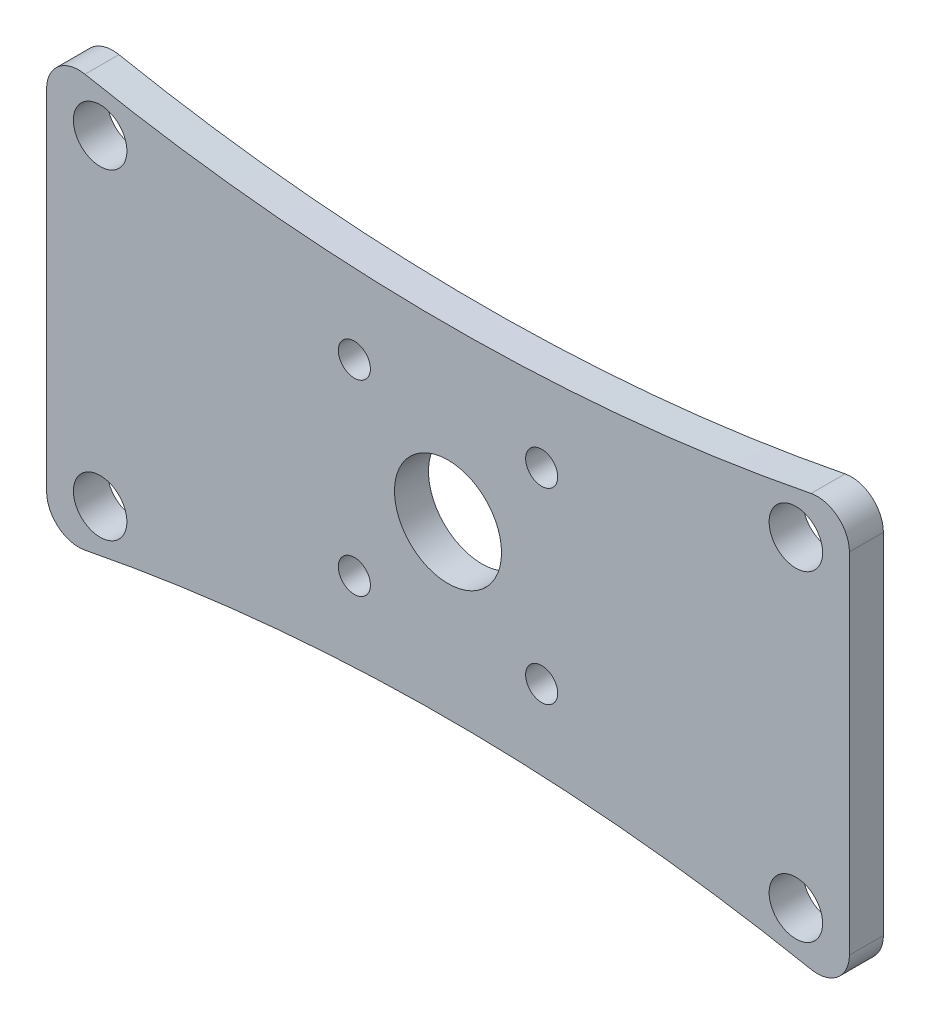
ISO-10303-21;
HEADER;
FILE_DESCRIPTION(('STEP AP214'),'2;1');
FILE_NAME('part.step','',(''),(''),'','','');
FILE_SCHEMA(('AUTOMOTIVE_DESIGN { 1 0 10303 214 1 1 1 1 }'));
ENDSEC;
DATA;
#1=APPLICATION_CONTEXT('core data for automotive mechanical design processes');
#2=APPLICATION_PROTOCOL_DEFINITION('international standard','automotive_design',2000,#1);
#3=PRODUCT_CONTEXT('',#1,'mechanical');
#4=PRODUCT('Part','Part','',(#3));
#5=PRODUCT_RELATED_PRODUCT_CATEGORY('part','',(#4));
#6=PRODUCT_DEFINITION_FORMATION('','',#4);
#7=PRODUCT_DEFINITION_CONTEXT('part definition',#1,'design');
#8=PRODUCT_DEFINITION('design','',#6,#7);
#9=PRODUCT_DEFINITION_SHAPE('','',#8);
#10=(LENGTH_UNIT() NAMED_UNIT(*) SI_UNIT(.MILLI.,.METRE.));
#11=(NAMED_UNIT(*) PLANE_ANGLE_UNIT() SI_UNIT($,.RADIAN.));
#12=(NAMED_UNIT(*) SI_UNIT($,.STERADIAN.) SOLID_ANGLE_UNIT());
#13=UNCERTAINTY_MEASURE_WITH_UNIT(LENGTH_MEASURE(1.E-05),#10,'distance_accuracy_value','');
#14=(GEOMETRIC_REPRESENTATION_CONTEXT(3) GLOBAL_UNCERTAINTY_ASSIGNED_CONTEXT((#13)) GLOBAL_UNIT_ASSIGNED_CONTEXT((#10,
#11,#12)) REPRESENTATION_CONTEXT('',''));
#15=CARTESIAN_POINT('',(0.,0.,0.));
#16=DIRECTION('',(0.,0.,1.));
#17=DIRECTION('',(1.,0.,0.));
#18=AXIS2_PLACEMENT_3D('',#15,#16,#17);
#19=CARTESIAN_POINT('',(0.,0.,3.175));
#20=DIRECTION('',(0.,0.,1.));
#21=DIRECTION('',(1.,0.,0.));
#22=AXIS2_PLACEMENT_3D('',#19,#20,#21);
#23=PLANE('',#22);
#24=CARTESIAN_POINT('',(0.,0.,3.175));
#25=DIRECTION('',(0.,0.,1.));
#26=DIRECTION('',(1.,0.,0.));
#27=AXIS2_PLACEMENT_3D('',#24,#25,#26);
#28=CIRCLE('',#27,5.);
#29=CARTESIAN_POINT('',(5.,0.,3.175));
#30=VERTEX_POINT('',#29);
#31=EDGE_CURVE('E213',#30,#30,#28,.T.);
#32=ORIENTED_EDGE('',*,*,#31,.F.);
#33=EDGE_LOOP('',(#32));
#34=FACE_BOUND('',#33,.T.);
#35=DIRECTION('',(0.,1.,0.));
#36=VECTOR('',#35,1.);
#37=CARTESIAN_POINT('',(37.5,20.,3.175));
#38=LINE('',#37,#36);
#39=CARTESIAN_POINT('',(37.5,-16.3103317887136,3.175));
#40=VERTEX_POINT('',#39);
#41=CARTESIAN_POINT('',(37.5,16.3103317887136,3.175));
#42=VERTEX_POINT('',#41);
#43=EDGE_CURVE('E120',#40,#42,#38,.T.);
#44=ORIENTED_EDGE('',*,*,#43,.T.);
#45=CARTESIAN_POINT('',(34.5,16.3103317887136,3.175));
#46=DIRECTION('',(0.,0.,1.));
#47=DIRECTION('',(1.,0.,0.));
#48=AXIS2_PLACEMENT_3D('',#45,#46,#47);
#49=CIRCLE('',#48,3.);
#50=CARTESIAN_POINT('',(33.9185393258427,19.2534429800226,3.175));
#51=VERTEX_POINT('',#50);
#52=EDGE_CURVE('E145',#42,#51,#49,.T.);
#53=ORIENTED_EDGE('',*,*,#52,.T.);
#54=CARTESIAN_POINT('',(0.,190.934929139717,3.175));
#55=DIRECTION('',(0.,0.,1.));
#56=DIRECTION('',(1.,0.,0.));
#57=AXIS2_PLACEMENT_3D('',#54,#55,#56);
#58=CIRCLE('',#57,175.);
#59=CARTESIAN_POINT('',(-33.9185393258427,19.2534429800226,3.175));
#60=VERTEX_POINT('',#59);
#61=EDGE_CURVE('E118',#60,#51,#58,.T.);
#62=ORIENTED_EDGE('',*,*,#61,.F.);
#63=CARTESIAN_POINT('',(-34.5,16.3103317887136,3.175));
#64=DIRECTION('',(0.,0.,1.));
#65=DIRECTION('',(1.,0.,0.));
#66=AXIS2_PLACEMENT_3D('',#63,#64,#65);
#67=CIRCLE('',#66,3.);
#68=CARTESIAN_POINT('',(-37.5,16.3103317887136,3.175));
#69=VERTEX_POINT('',#68);
#70=EDGE_CURVE('E53',#60,#69,#67,.T.);
#71=ORIENTED_EDGE('',*,*,#70,.T.);
#72=DIRECTION('',(0.,-1.,0.));
#73=VECTOR('',#72,1.);
#74=CARTESIAN_POINT('',(-37.5,20.,3.175));
#75=LINE('',#74,#73);
#76=CARTESIAN_POINT('',(-37.5,-16.3103317887136,3.175));
#77=VERTEX_POINT('',#76);
#78=EDGE_CURVE('E124',#69,#77,#75,.T.);
#79=ORIENTED_EDGE('',*,*,#78,.T.);
#80=CARTESIAN_POINT('',(-34.5,-16.3103317887136,3.175));
#81=DIRECTION('',(0.,0.,1.));
#82=DIRECTION('',(1.,0.,0.));
#83=AXIS2_PLACEMENT_3D('',#80,#81,#82);
#84=CIRCLE('',#83,3.);
#85=CARTESIAN_POINT('',(-33.9185393258427,-19.2534429800226,3.175));
#86=VERTEX_POINT('',#85);
#87=EDGE_CURVE('E141',#77,#86,#84,.T.);
#88=ORIENTED_EDGE('',*,*,#87,.T.);
#89=CARTESIAN_POINT('',(0.,-190.934929139717,3.175));
#90=DIRECTION('',(0.,0.,1.));
#91=DIRECTION('',(1.,0.,0.));
#92=AXIS2_PLACEMENT_3D('',#89,#90,#91);
#93=CIRCLE('',#92,175.);
#94=CARTESIAN_POINT('',(33.9185393258427,-19.2534429800226,3.175));
#95=VERTEX_POINT('',#94);
#96=EDGE_CURVE('E207',#95,#86,#93,.T.);
#97=ORIENTED_EDGE('',*,*,#96,.F.);
#98=CARTESIAN_POINT('',(34.5,-16.3103317887136,3.175));
#99=DIRECTION('',(0.,0.,1.));
#100=DIRECTION('',(1.,0.,0.));
#101=AXIS2_PLACEMENT_3D('',#98,#99,#100);
#102=CIRCLE('',#101,3.);
#103=EDGE_CURVE('E143',#95,#40,#102,.T.);
#104=ORIENTED_EDGE('',*,*,#103,.T.);
#105=EDGE_LOOP('',(#44,#53,#62,#71,#79,#88,#97,#104));
#106=FACE_BOUND('',#105,.T.);
#107=CARTESIAN_POINT('',(8.74999999999998,-8.74999999999999,3.175));
#108=DIRECTION('',(0.,0.,1.));
#109=DIRECTION('',(1.,0.,0.));
#110=AXIS2_PLACEMENT_3D('',#107,#108,#109);
#111=CIRCLE('',#110,1.5);
#112=CARTESIAN_POINT('',(10.25,-8.74999999999999,3.175));
#113=VERTEX_POINT('',#112);
#114=EDGE_CURVE('E192',#113,#113,#111,.T.);
#115=ORIENTED_EDGE('',*,*,#114,.F.);
#116=EDGE_LOOP('',(#115));
#117=FACE_BOUND('',#116,.T.);
#118=CARTESIAN_POINT('',(-8.75000000000001,8.75000000000001,3.175));
#119=DIRECTION('',(0.,0.,1.));
#120=DIRECTION('',(1.,0.,0.));
#121=AXIS2_PLACEMENT_3D('',#118,#119,#120);
#122=CIRCLE('',#121,1.5);
#123=CARTESIAN_POINT('',(-7.25000000000001,8.75000000000001,3.175));
#124=VERTEX_POINT('',#123);
#125=EDGE_CURVE('E180',#124,#124,#122,.T.);
#126=ORIENTED_EDGE('',*,*,#125,.F.);
#127=EDGE_LOOP('',(#126));
#128=FACE_BOUND('',#127,.T.);
#129=CARTESIAN_POINT('',(32.5,-15.,3.175));
#130=DIRECTION('',(0.,0.,1.));
#131=DIRECTION('',(1.,0.,0.));
#132=AXIS2_PLACEMENT_3D('',#129,#130,#131);
#133=CIRCLE('',#132,2.5);
#134=CARTESIAN_POINT('',(35.,-15.,3.175));
#135=VERTEX_POINT('',#134);
#136=EDGE_CURVE('E168',#135,#135,#133,.T.);
#137=ORIENTED_EDGE('',*,*,#136,.F.);
#138=EDGE_LOOP('',(#137));
#139=FACE_BOUND('',#138,.T.);
#140=CARTESIAN_POINT('',(-32.5,15.,3.175));
#141=DIRECTION('',(0.,0.,1.));
#142=DIRECTION('',(1.,0.,0.));
#143=AXIS2_PLACEMENT_3D('',#140,#141,#142);
#144=CIRCLE('',#143,2.50000000000001);
#145=CARTESIAN_POINT('',(-30.,15.,3.175));
#146=VERTEX_POINT('',#145);
#147=EDGE_CURVE('E158',#146,#146,#144,.T.);
#148=ORIENTED_EDGE('',*,*,#147,.F.);
#149=EDGE_LOOP('',(#148));
#150=FACE_BOUND('',#149,.T.);
#151=CARTESIAN_POINT('',(32.5,15.,3.175));
#152=DIRECTION('',(0.,0.,1.));
#153=DIRECTION('',(1.,0.,0.));
#154=AXIS2_PLACEMENT_3D('',#151,#152,#153);
#155=CIRCLE('',#154,2.50000000000001);
#156=CARTESIAN_POINT('',(35.,15.,3.175));
#157=VERTEX_POINT('',#156);
#158=EDGE_CURVE('E163',#157,#157,#155,.T.);
#159=ORIENTED_EDGE('',*,*,#158,.F.);
#160=EDGE_LOOP('',(#159));
#161=FACE_BOUND('',#160,.T.);
#162=CARTESIAN_POINT('',(-32.5,-15.,3.175));
#163=DIRECTION('',(0.,0.,1.));
#164=DIRECTION('',(1.,0.,0.));
#165=AXIS2_PLACEMENT_3D('',#162,#163,#164);
#166=CIRCLE('',#165,2.5);
#167=CARTESIAN_POINT('',(-30.,-15.,3.175));
#168=VERTEX_POINT('',#167);
#169=EDGE_CURVE('E174',#168,#168,#166,.T.);
#170=ORIENTED_EDGE('',*,*,#169,.F.);
#171=EDGE_LOOP('',(#170));
#172=FACE_BOUND('',#171,.T.);
#173=CARTESIAN_POINT('',(8.74999999999998,8.75000000000001,3.175));
#174=DIRECTION('',(0.,0.,1.));
#175=DIRECTION('',(1.,0.,0.));
#176=AXIS2_PLACEMENT_3D('',#173,#174,#175);
#177=CIRCLE('',#176,1.5);
#178=CARTESIAN_POINT('',(10.25,8.75000000000001,3.175));
#179=VERTEX_POINT('',#178);
#180=EDGE_CURVE('E186',#179,#179,#177,.T.);
#181=ORIENTED_EDGE('',*,*,#180,.F.);
#182=EDGE_LOOP('',(#181));
#183=FACE_BOUND('',#182,.T.);
#184=CARTESIAN_POINT('',(-8.75000000000001,-8.74999999999999,3.175));
#185=DIRECTION('',(0.,0.,1.));
#186=DIRECTION('',(1.,0.,0.));
#187=AXIS2_PLACEMENT_3D('',#184,#185,#186);
#188=CIRCLE('',#187,1.5);
#189=CARTESIAN_POINT('',(-7.25000000000001,-8.74999999999999,3.175));
#190=VERTEX_POINT('',#189);
#191=EDGE_CURVE('E198',#190,#190,#188,.T.);
#192=ORIENTED_EDGE('',*,*,#191,.F.);
#193=EDGE_LOOP('',(#192));
#194=FACE_BOUND('',#193,.T.);
#195=ADVANCED_FACE('F33',(#34,#106,#117,#128,#139,#150,#161,#172,#183,#194),#23,.T.);
#196=CARTESIAN_POINT('',(0.,0.,0.));
#197=DIRECTION('',(0.,0.,1.));
#198=DIRECTION('',(1.,0.,0.));
#199=AXIS2_PLACEMENT_3D('',#196,#197,#198);
#200=PLANE('',#199);
#201=CARTESIAN_POINT('',(0.,0.,0.));
#202=DIRECTION('',(0.,0.,1.));
#203=DIRECTION('',(1.,0.,0.));
#204=AXIS2_PLACEMENT_3D('',#201,#202,#203);
#205=CIRCLE('',#204,5.);
#206=CARTESIAN_POINT('',(5.,0.,0.));
#207=VERTEX_POINT('',#206);
#208=EDGE_CURVE('E210',#207,#207,#205,.T.);
#209=ORIENTED_EDGE('',*,*,#208,.T.);
#210=EDGE_LOOP('',(#209));
#211=FACE_BOUND('',#210,.T.);
#212=CARTESIAN_POINT('',(8.74999999999998,-8.74999999999999,0.));
#213=DIRECTION('',(0.,0.,1.));
#214=DIRECTION('',(1.,0.,0.));
#215=AXIS2_PLACEMENT_3D('',#212,#213,#214);
#216=CIRCLE('',#215,1.5);
#217=CARTESIAN_POINT('',(10.25,-8.74999999999999,0.));
#218=VERTEX_POINT('',#217);
#219=EDGE_CURVE('E195',#218,#218,#216,.T.);
#220=ORIENTED_EDGE('',*,*,#219,.T.);
#221=EDGE_LOOP('',(#220));
#222=FACE_BOUND('',#221,.T.);
#223=CARTESIAN_POINT('',(-8.75000000000001,8.75000000000001,0.));
#224=DIRECTION('',(0.,0.,1.));
#225=DIRECTION('',(1.,0.,0.));
#226=AXIS2_PLACEMENT_3D('',#223,#224,#225);
#227=CIRCLE('',#226,1.5);
#228=CARTESIAN_POINT('',(-7.25000000000001,8.75000000000001,0.));
#229=VERTEX_POINT('',#228);
#230=EDGE_CURVE('E183',#229,#229,#227,.T.);
#231=ORIENTED_EDGE('',*,*,#230,.T.);
#232=EDGE_LOOP('',(#231));
#233=FACE_BOUND('',#232,.T.);
#234=CARTESIAN_POINT('',(32.5,-15.,0.));
#235=DIRECTION('',(0.,0.,1.));
#236=DIRECTION('',(1.,0.,0.));
#237=AXIS2_PLACEMENT_3D('',#234,#235,#236);
#238=CIRCLE('',#237,2.5);
#239=CARTESIAN_POINT('',(35.,-15.,0.));
#240=VERTEX_POINT('',#239);
#241=EDGE_CURVE('E171',#240,#240,#238,.T.);
#242=ORIENTED_EDGE('',*,*,#241,.T.);
#243=EDGE_LOOP('',(#242));
#244=FACE_BOUND('',#243,.T.);
#245=CARTESIAN_POINT('',(-32.5,15.,0.));
#246=DIRECTION('',(0.,0.,1.));
#247=DIRECTION('',(1.,0.,0.));
#248=AXIS2_PLACEMENT_3D('',#245,#246,#247);
#249=CIRCLE('',#248,2.50000000000001);
#250=CARTESIAN_POINT('',(-30.,15.,0.));
#251=VERTEX_POINT('',#250);
#252=EDGE_CURVE('E156',#251,#251,#249,.T.);
#253=ORIENTED_EDGE('',*,*,#252,.T.);
#254=EDGE_LOOP('',(#253));
#255=FACE_BOUND('',#254,.T.);
#256=CARTESIAN_POINT('',(0.,190.934929139717,0.));
#257=DIRECTION('',(0.,0.,1.));
#258=DIRECTION('',(1.,0.,0.));
#259=AXIS2_PLACEMENT_3D('',#256,#257,#258);
#260=CIRCLE('',#259,175.);
#261=CARTESIAN_POINT('',(-33.9185393258427,19.2534429800226,0.));
#262=VERTEX_POINT('',#261);
#263=CARTESIAN_POINT('',(33.9185393258427,19.2534429800226,0.));
#264=VERTEX_POINT('',#263);
#265=EDGE_CURVE('E102',#262,#264,#260,.T.);
#266=ORIENTED_EDGE('',*,*,#265,.T.);
#267=CARTESIAN_POINT('',(34.5,16.3103317887136,0.));
#268=DIRECTION('',(0.,0.,1.));
#269=DIRECTION('',(1.,0.,0.));
#270=AXIS2_PLACEMENT_3D('',#267,#268,#269);
#271=CIRCLE('',#270,3.);
#272=CARTESIAN_POINT('',(37.5,16.3103317887136,0.));
#273=VERTEX_POINT('',#272);
#274=EDGE_CURVE('E133',#264,#273,#271,.F.);
#275=ORIENTED_EDGE('',*,*,#274,.T.);
#276=DIRECTION('',(0.,1.,0.));
#277=VECTOR('',#276,1.);
#278=CARTESIAN_POINT('',(37.5,20.,0.));
#279=LINE('',#278,#277);
#280=CARTESIAN_POINT('',(37.5,-16.3103317887136,0.));
#281=VERTEX_POINT('',#280);
#282=EDGE_CURVE('E127',#281,#273,#279,.T.);
#283=ORIENTED_EDGE('',*,*,#282,.F.);
#284=CARTESIAN_POINT('',(34.5,-16.3103317887136,0.));
#285=DIRECTION('',(0.,0.,1.));
#286=DIRECTION('',(1.,0.,0.));
#287=AXIS2_PLACEMENT_3D('',#284,#285,#286);
#288=CIRCLE('',#287,3.);
#289=CARTESIAN_POINT('',(33.9185393258427,-19.2534429800226,0.));
#290=VERTEX_POINT('',#289);
#291=EDGE_CURVE('E131',#281,#290,#288,.F.);
#292=ORIENTED_EDGE('',*,*,#291,.T.);
#293=CARTESIAN_POINT('',(0.,-190.934929139717,0.));
#294=DIRECTION('',(0.,0.,1.));
#295=DIRECTION('',(1.,0.,0.));
#296=AXIS2_PLACEMENT_3D('',#293,#294,#295);
#297=CIRCLE('',#296,175.);
#298=CARTESIAN_POINT('',(-33.9185393258427,-19.2534429800226,0.));
#299=VERTEX_POINT('',#298);
#300=EDGE_CURVE('E205',#290,#299,#297,.T.);
#301=ORIENTED_EDGE('',*,*,#300,.T.);
#302=CARTESIAN_POINT('',(-34.5,-16.3103317887136,0.));
#303=DIRECTION('',(0.,0.,1.));
#304=DIRECTION('',(1.,0.,0.));
#305=AXIS2_PLACEMENT_3D('',#302,#303,#304);
#306=CIRCLE('',#305,3.);
#307=CARTESIAN_POINT('',(-37.5,-16.3103317887136,0.));
#308=VERTEX_POINT('',#307);
#309=EDGE_CURVE('E108',#299,#308,#306,.F.);
#310=ORIENTED_EDGE('',*,*,#309,.T.);
#311=DIRECTION('',(0.,-1.,0.));
#312=VECTOR('',#311,1.);
#313=CARTESIAN_POINT('',(-37.5,20.,0.));
#314=LINE('',#313,#312);
#315=CARTESIAN_POINT('',(-37.5,16.3103317887136,0.));
#316=VERTEX_POINT('',#315);
#317=EDGE_CURVE('E103',#316,#308,#314,.T.);
#318=ORIENTED_EDGE('',*,*,#317,.F.);
#319=CARTESIAN_POINT('',(-34.5,16.3103317887136,0.));
#320=DIRECTION('',(0.,0.,1.));
#321=DIRECTION('',(1.,0.,0.));
#322=AXIS2_PLACEMENT_3D('',#319,#320,#321);
#323=CIRCLE('',#322,3.);
#324=EDGE_CURVE('E98',#316,#262,#323,.F.);
#325=ORIENTED_EDGE('',*,*,#324,.T.);
#326=EDGE_LOOP('',(#266,#275,#283,#292,#301,#310,#318,#325));
#327=FACE_BOUND('',#326,.T.);
#328=CARTESIAN_POINT('',(32.5,15.,0.));
#329=DIRECTION('',(0.,0.,1.));
#330=DIRECTION('',(1.,0.,0.));
#331=AXIS2_PLACEMENT_3D('',#328,#329,#330);
#332=CIRCLE('',#331,2.50000000000001);
#333=CARTESIAN_POINT('',(35.,15.,0.));
#334=VERTEX_POINT('',#333);
#335=EDGE_CURVE('E165',#334,#334,#332,.T.);
#336=ORIENTED_EDGE('',*,*,#335,.T.);
#337=EDGE_LOOP('',(#336));
#338=FACE_BOUND('',#337,.T.);
#339=CARTESIAN_POINT('',(-32.5,-15.,0.));
#340=DIRECTION('',(0.,0.,1.));
#341=DIRECTION('',(1.,0.,0.));
#342=AXIS2_PLACEMENT_3D('',#339,#340,#341);
#343=CIRCLE('',#342,2.5);
#344=CARTESIAN_POINT('',(-30.,-15.,0.));
#345=VERTEX_POINT('',#344);
#346=EDGE_CURVE('E177',#345,#345,#343,.T.);
#347=ORIENTED_EDGE('',*,*,#346,.T.);
#348=EDGE_LOOP('',(#347));
#349=FACE_BOUND('',#348,.T.);
#350=CARTESIAN_POINT('',(8.74999999999998,8.75000000000001,0.));
#351=DIRECTION('',(0.,0.,1.));
#352=DIRECTION('',(1.,0.,0.));
#353=AXIS2_PLACEMENT_3D('',#350,#351,#352);
#354=CIRCLE('',#353,1.5);
#355=CARTESIAN_POINT('',(10.25,8.75000000000001,0.));
#356=VERTEX_POINT('',#355);
#357=EDGE_CURVE('E189',#356,#356,#354,.T.);
#358=ORIENTED_EDGE('',*,*,#357,.T.);
#359=EDGE_LOOP('',(#358));
#360=FACE_BOUND('',#359,.T.);
#361=CARTESIAN_POINT('',(-8.75000000000001,-8.74999999999999,0.));
#362=DIRECTION('',(0.,0.,1.));
#363=DIRECTION('',(1.,0.,0.));
#364=AXIS2_PLACEMENT_3D('',#361,#362,#363);
#365=CIRCLE('',#364,1.5);
#366=CARTESIAN_POINT('',(-7.25000000000001,-8.74999999999999,0.));
#367=VERTEX_POINT('',#366);
#368=EDGE_CURVE('E117',#367,#367,#365,.T.);
#369=ORIENTED_EDGE('',*,*,#368,.T.);
#370=EDGE_LOOP('',(#369));
#371=FACE_BOUND('',#370,.T.);
#372=ADVANCED_FACE('F100',(#211,#222,#233,#244,#255,#327,#338,#349,#360,#371),#200,.F.);
#373=CARTESIAN_POINT('',(-37.5,20.,3.175));
#374=DIRECTION('',(1.,0.,0.));
#375=DIRECTION('',(0.,1.,0.));
#376=AXIS2_PLACEMENT_3D('',#373,#374,#375);
#377=PLANE('',#376);
#378=ORIENTED_EDGE('',*,*,#317,.T.);
#379=DIRECTION('',(0.,0.,1.));
#380=VECTOR('',#379,1.);
#381=CARTESIAN_POINT('',(-37.5,-16.3103317887136,3.175));
#382=LINE('',#381,#380);
#383=EDGE_CURVE('E11',#308,#77,#382,.T.);
#384=ORIENTED_EDGE('',*,*,#383,.T.);
#385=ORIENTED_EDGE('',*,*,#78,.F.);
#386=DIRECTION('',(0.,0.,1.));
#387=VECTOR('',#386,1.);
#388=CARTESIAN_POINT('',(-37.5,16.3103317887136,3.175));
#389=LINE('',#388,#387);
#390=EDGE_CURVE('E41',#69,#316,#389,.F.);
#391=ORIENTED_EDGE('',*,*,#390,.T.);
#392=EDGE_LOOP('',(#378,#384,#385,#391));
#393=FACE_BOUND('',#392,.T.);
#394=ADVANCED_FACE('F151',(#393),#377,.F.);
#395=CARTESIAN_POINT('',(37.5,20.,3.175));
#396=DIRECTION('',(-1.,0.,0.));
#397=DIRECTION('',(0.,-1.,0.));
#398=AXIS2_PLACEMENT_3D('',#395,#396,#397);
#399=PLANE('',#398);
#400=ORIENTED_EDGE('',*,*,#282,.T.);
#401=DIRECTION('',(0.,0.,1.));
#402=VECTOR('',#401,1.);
#403=CARTESIAN_POINT('',(37.5,16.3103317887136,3.175));
#404=LINE('',#403,#402);
#405=EDGE_CURVE('E138',#273,#42,#404,.T.);
#406=ORIENTED_EDGE('',*,*,#405,.T.);
#407=ORIENTED_EDGE('',*,*,#43,.F.);
#408=DIRECTION('',(0.,0.,1.));
#409=VECTOR('',#408,1.);
#410=CARTESIAN_POINT('',(37.5,-16.3103317887136,3.175));
#411=LINE('',#410,#409);
#412=EDGE_CURVE('E135',#40,#281,#411,.F.);
#413=ORIENTED_EDGE('',*,*,#412,.T.);
#414=EDGE_LOOP('',(#400,#406,#407,#413));
#415=FACE_BOUND('',#414,.T.);
#416=ADVANCED_FACE('F259',(#415),#399,.F.);
#417=CARTESIAN_POINT('',(-32.5,15.,3.175));
#418=DIRECTION('',(0.,0.,-1.));
#419=DIRECTION('',(-1.,0.,0.));
#420=AXIS2_PLACEMENT_3D('',#417,#418,#419);
#421=CYLINDRICAL_SURFACE('',#420,2.50000000000001);
#422=ORIENTED_EDGE('',*,*,#147,.T.);
#423=EDGE_LOOP('',(#422));
#424=FACE_BOUND('',#423,.T.);
#425=ORIENTED_EDGE('',*,*,#252,.F.);
#426=EDGE_LOOP('',(#425));
#427=FACE_BOUND('',#426,.T.);
#428=ADVANCED_FACE('F264',(#424,#427),#421,.F.);
#429=CARTESIAN_POINT('',(32.5,15.,3.175));
#430=DIRECTION('',(0.,0.,-1.));
#431=DIRECTION('',(-1.,0.,0.));
#432=AXIS2_PLACEMENT_3D('',#429,#430,#431);
#433=CYLINDRICAL_SURFACE('',#432,2.50000000000001);
#434=ORIENTED_EDGE('',*,*,#158,.T.);
#435=EDGE_LOOP('',(#434));
#436=FACE_BOUND('',#435,.T.);
#437=ORIENTED_EDGE('',*,*,#335,.F.);
#438=EDGE_LOOP('',(#437));
#439=FACE_BOUND('',#438,.T.);
#440=ADVANCED_FACE('F315',(#436,#439),#433,.F.);
#441=CARTESIAN_POINT('',(32.5,-15.,3.175));
#442=DIRECTION('',(0.,0.,-1.));
#443=DIRECTION('',(-1.,0.,0.));
#444=AXIS2_PLACEMENT_3D('',#441,#442,#443);
#445=CYLINDRICAL_SURFACE('',#444,2.5);
#446=ORIENTED_EDGE('',*,*,#136,.T.);
#447=EDGE_LOOP('',(#446));
#448=FACE_BOUND('',#447,.T.);
#449=ORIENTED_EDGE('',*,*,#241,.F.);
#450=EDGE_LOOP('',(#449));
#451=FACE_BOUND('',#450,.T.);
#452=ADVANCED_FACE('F311',(#448,#451),#445,.F.);
#453=CARTESIAN_POINT('',(-32.5,-15.,3.175));
#454=DIRECTION('',(0.,0.,-1.));
#455=DIRECTION('',(-1.,0.,0.));
#456=AXIS2_PLACEMENT_3D('',#453,#454,#455);
#457=CYLINDRICAL_SURFACE('',#456,2.5);
#458=ORIENTED_EDGE('',*,*,#169,.T.);
#459=EDGE_LOOP('',(#458));
#460=FACE_BOUND('',#459,.T.);
#461=ORIENTED_EDGE('',*,*,#346,.F.);
#462=EDGE_LOOP('',(#461));
#463=FACE_BOUND('',#462,.T.);
#464=ADVANCED_FACE('F307',(#460,#463),#457,.F.);
#465=CARTESIAN_POINT('',(-8.75000000000001,8.75000000000001,3.175));
#466=DIRECTION('',(0.,0.,-1.));
#467=DIRECTION('',(-1.,0.,0.));
#468=AXIS2_PLACEMENT_3D('',#465,#466,#467);
#469=CYLINDRICAL_SURFACE('',#468,1.5);
#470=ORIENTED_EDGE('',*,*,#125,.T.);
#471=EDGE_LOOP('',(#470));
#472=FACE_BOUND('',#471,.T.);
#473=ORIENTED_EDGE('',*,*,#230,.F.);
#474=EDGE_LOOP('',(#473));
#475=FACE_BOUND('',#474,.T.);
#476=ADVANCED_FACE('F303',(#472,#475),#469,.F.);
#477=CARTESIAN_POINT('',(8.74999999999998,8.75000000000001,3.175));
#478=DIRECTION('',(0.,0.,-1.));
#479=DIRECTION('',(-1.,0.,0.));
#480=AXIS2_PLACEMENT_3D('',#477,#478,#479);
#481=CYLINDRICAL_SURFACE('',#480,1.5);
#482=ORIENTED_EDGE('',*,*,#180,.T.);
#483=EDGE_LOOP('',(#482));
#484=FACE_BOUND('',#483,.T.);
#485=ORIENTED_EDGE('',*,*,#357,.F.);
#486=EDGE_LOOP('',(#485));
#487=FACE_BOUND('',#486,.T.);
#488=ADVANCED_FACE('F299',(#484,#487),#481,.F.);
#489=CARTESIAN_POINT('',(8.74999999999998,-8.74999999999999,3.175));
#490=DIRECTION('',(0.,0.,-1.));
#491=DIRECTION('',(-1.,0.,0.));
#492=AXIS2_PLACEMENT_3D('',#489,#490,#491);
#493=CYLINDRICAL_SURFACE('',#492,1.5);
#494=ORIENTED_EDGE('',*,*,#114,.T.);
#495=EDGE_LOOP('',(#494));
#496=FACE_BOUND('',#495,.T.);
#497=ORIENTED_EDGE('',*,*,#219,.F.);
#498=EDGE_LOOP('',(#497));
#499=FACE_BOUND('',#498,.T.);
#500=ADVANCED_FACE('F250',(#496,#499),#493,.F.);
#501=CARTESIAN_POINT('',(-8.75000000000001,-8.74999999999999,3.175));
#502=DIRECTION('',(0.,0.,-1.));
#503=DIRECTION('',(-1.,0.,0.));
#504=AXIS2_PLACEMENT_3D('',#501,#502,#503);
#505=CYLINDRICAL_SURFACE('',#504,1.5);
#506=ORIENTED_EDGE('',*,*,#191,.T.);
#507=EDGE_LOOP('',(#506));
#508=FACE_BOUND('',#507,.T.);
#509=ORIENTED_EDGE('',*,*,#368,.F.);
#510=EDGE_LOOP('',(#509));
#511=FACE_BOUND('',#510,.T.);
#512=ADVANCED_FACE('F247',(#508,#511),#505,.F.);
#513=CARTESIAN_POINT('',(0.,190.934929139717,0.));
#514=DIRECTION('',(0.,0.,1.));
#515=DIRECTION('',(1.,0.,0.));
#516=AXIS2_PLACEMENT_3D('',#513,#514,#515);
#517=CYLINDRICAL_SURFACE('',#516,175.);
#518=ORIENTED_EDGE('',*,*,#61,.T.);
#519=DIRECTION('',(0.,0.,1.));
#520=VECTOR('',#519,1.);
#521=CARTESIAN_POINT('',(33.9185393258427,19.2534429800226,0.));
#522=LINE('',#521,#520);
#523=EDGE_CURVE('E109',#51,#264,#522,.F.);
#524=ORIENTED_EDGE('',*,*,#523,.T.);
#525=ORIENTED_EDGE('',*,*,#265,.F.);
#526=DIRECTION('',(0.,0.,1.));
#527=VECTOR('',#526,1.);
#528=CARTESIAN_POINT('',(-33.9185393258427,19.2534429800226,0.));
#529=LINE('',#528,#527);
#530=EDGE_CURVE('E115',#262,#60,#529,.T.);
#531=ORIENTED_EDGE('',*,*,#530,.T.);
#532=EDGE_LOOP('',(#518,#524,#525,#531));
#533=FACE_BOUND('',#532,.T.);
#534=ADVANCED_FACE('F114',(#533),#517,.F.);
#535=CARTESIAN_POINT('',(0.,-190.934929139717,0.));
#536=DIRECTION('',(0.,0.,1.));
#537=DIRECTION('',(1.,0.,0.));
#538=AXIS2_PLACEMENT_3D('',#535,#536,#537);
#539=CYLINDRICAL_SURFACE('',#538,175.);
#540=ORIENTED_EDGE('',*,*,#300,.F.);
#541=DIRECTION('',(0.,0.,1.));
#542=VECTOR('',#541,1.);
#543=CARTESIAN_POINT('',(33.9185393258427,-19.2534429800226,0.));
#544=LINE('',#543,#542);
#545=EDGE_CURVE('E150',#290,#95,#544,.T.);
#546=ORIENTED_EDGE('',*,*,#545,.T.);
#547=ORIENTED_EDGE('',*,*,#96,.T.);
#548=DIRECTION('',(0.,0.,1.));
#549=VECTOR('',#548,1.);
#550=CARTESIAN_POINT('',(-33.9185393258427,-19.2534429800226,0.));
#551=LINE('',#550,#549);
#552=EDGE_CURVE('E147',#86,#299,#551,.F.);
#553=ORIENTED_EDGE('',*,*,#552,.T.);
#554=EDGE_LOOP('',(#540,#546,#547,#553));
#555=FACE_BOUND('',#554,.T.);
#556=ADVANCED_FACE('F271',(#555),#539,.F.);
#557=CARTESIAN_POINT('',(34.5,16.3103317887136,0.));
#558=DIRECTION('',(0.,0.,1.));
#559=DIRECTION('',(1.,0.,0.));
#560=AXIS2_PLACEMENT_3D('',#557,#558,#559);
#561=CYLINDRICAL_SURFACE('',#560,3.);
#562=ORIENTED_EDGE('',*,*,#52,.F.);
#563=ORIENTED_EDGE('',*,*,#405,.F.);
#564=ORIENTED_EDGE('',*,*,#274,.F.);
#565=ORIENTED_EDGE('',*,*,#523,.F.);
#566=EDGE_LOOP('',(#562,#563,#564,#565));
#567=FACE_BOUND('',#566,.T.);
#568=ADVANCED_FACE('F267',(#567),#561,.T.);
#569=CARTESIAN_POINT('',(34.5,-16.3103317887136,0.));
#570=DIRECTION('',(0.,0.,1.));
#571=DIRECTION('',(1.,0.,0.));
#572=AXIS2_PLACEMENT_3D('',#569,#570,#571);
#573=CYLINDRICAL_SURFACE('',#572,3.);
#574=ORIENTED_EDGE('',*,*,#103,.F.);
#575=ORIENTED_EDGE('',*,*,#545,.F.);
#576=ORIENTED_EDGE('',*,*,#291,.F.);
#577=ORIENTED_EDGE('',*,*,#412,.F.);
#578=EDGE_LOOP('',(#574,#575,#576,#577));
#579=FACE_BOUND('',#578,.T.);
#580=ADVANCED_FACE('F270',(#579),#573,.T.);
#581=CARTESIAN_POINT('',(-34.5,-16.3103317887136,0.));
#582=DIRECTION('',(0.,0.,1.));
#583=DIRECTION('',(1.,0.,0.));
#584=AXIS2_PLACEMENT_3D('',#581,#582,#583);
#585=CYLINDRICAL_SURFACE('',#584,3.);
#586=ORIENTED_EDGE('',*,*,#87,.F.);
#587=ORIENTED_EDGE('',*,*,#383,.F.);
#588=ORIENTED_EDGE('',*,*,#309,.F.);
#589=ORIENTED_EDGE('',*,*,#552,.F.);
#590=EDGE_LOOP('',(#586,#587,#588,#589));
#591=FACE_BOUND('',#590,.T.);
#592=ADVANCED_FACE('F274',(#591),#585,.T.);
#593=CARTESIAN_POINT('',(-34.5,16.3103317887136,0.));
#594=DIRECTION('',(0.,0.,1.));
#595=DIRECTION('',(1.,0.,0.));
#596=AXIS2_PLACEMENT_3D('',#593,#594,#595);
#597=CYLINDRICAL_SURFACE('',#596,3.);
#598=ORIENTED_EDGE('',*,*,#70,.F.);
#599=ORIENTED_EDGE('',*,*,#530,.F.);
#600=ORIENTED_EDGE('',*,*,#324,.F.);
#601=ORIENTED_EDGE('',*,*,#390,.F.);
#602=EDGE_LOOP('',(#598,#599,#600,#601));
#603=FACE_BOUND('',#602,.T.);
#604=ADVANCED_FACE('F35',(#603),#597,.T.);
#605=CARTESIAN_POINT('',(0.,0.,0.));
#606=DIRECTION('',(0.,0.,1.));
#607=DIRECTION('',(1.,0.,0.));
#608=AXIS2_PLACEMENT_3D('',#605,#606,#607);
#609=CYLINDRICAL_SURFACE('',#608,5.);
#610=ORIENTED_EDGE('',*,*,#208,.F.);
#611=EDGE_LOOP('',(#610));
#612=FACE_BOUND('',#611,.T.);
#613=ORIENTED_EDGE('',*,*,#31,.T.);
#614=EDGE_LOOP('',(#613));
#615=FACE_BOUND('',#614,.T.);
#616=ADVANCED_FACE('F221',(#612,#615),#609,.F.);
#617=CLOSED_SHELL('',(#195,#372,#394,#416,#428,#440,#452,#464,#476,#488,#500,#512,#534,#556,
#568,#580,#592,#604,#616));
#618=MANIFOLD_SOLID_BREP('B2',#617);
#619=ADVANCED_BREP_SHAPE_REPRESENTATION('',(#18,#618),#14);
#620=SHAPE_DEFINITION_REPRESENTATION(#9,#619);
ENDSEC;
END-ISO-10303-21;
